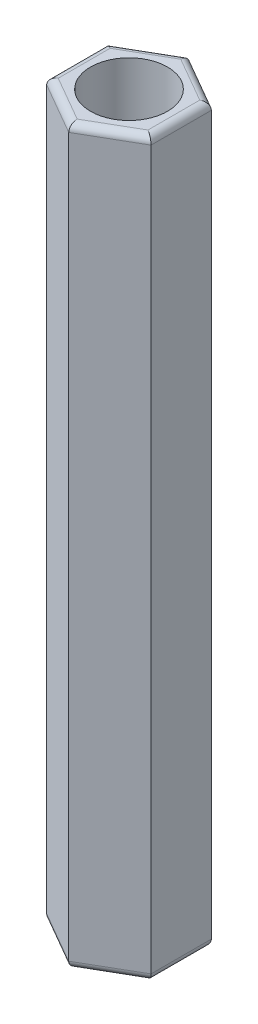
ISO-10303-21;
HEADER;
FILE_DESCRIPTION(('STEP AP214'),'2;1');
FILE_NAME('part.step','',(''),(''),'','','');
FILE_SCHEMA(('AUTOMOTIVE_DESIGN { 1 0 10303 214 1 1 1 1 }'));
ENDSEC;
DATA;
#1=APPLICATION_CONTEXT('core data for automotive mechanical design processes');
#2=APPLICATION_PROTOCOL_DEFINITION('international standard','automotive_design',2000,#1);
#3=PRODUCT_CONTEXT('',#1,'mechanical');
#4=PRODUCT('Part','Part','',(#3));
#5=PRODUCT_RELATED_PRODUCT_CATEGORY('part','',(#4));
#6=PRODUCT_DEFINITION_FORMATION('','',#4);
#7=PRODUCT_DEFINITION_CONTEXT('part definition',#1,'design');
#8=PRODUCT_DEFINITION('design','',#6,#7);
#9=PRODUCT_DEFINITION_SHAPE('','',#8);
#10=(LENGTH_UNIT() NAMED_UNIT(*) SI_UNIT(.MILLI.,.METRE.));
#11=(NAMED_UNIT(*) PLANE_ANGLE_UNIT() SI_UNIT($,.RADIAN.));
#12=(NAMED_UNIT(*) SI_UNIT($,.STERADIAN.) SOLID_ANGLE_UNIT());
#13=UNCERTAINTY_MEASURE_WITH_UNIT(LENGTH_MEASURE(1.E-05),#10,'distance_accuracy_value','');
#14=(GEOMETRIC_REPRESENTATION_CONTEXT(3) GLOBAL_UNCERTAINTY_ASSIGNED_CONTEXT((#13)) GLOBAL_UNIT_ASSIGNED_CONTEXT((#10,
#11,#12)) REPRESENTATION_CONTEXT('',''));
#15=CARTESIAN_POINT('',(0.,0.,0.));
#16=DIRECTION('',(0.,0.,1.));
#17=DIRECTION('',(1.,0.,0.));
#18=AXIS2_PLACEMENT_3D('',#15,#16,#17);
#19=CARTESIAN_POINT('',(0.,20.,0.));
#20=DIRECTION('',(0.,1.,0.));
#21=DIRECTION('',(0.,0.,1.));
#22=AXIS2_PLACEMENT_3D('',#19,#20,#21);
#23=PLANE('',#22);
#24=DIRECTION('',(-0.866025403784438,0.,0.5));
#25=VECTOR('',#24,1.);
#26=CARTESIAN_POINT('',(-1.325,20.,-0.649519052838329));
#27=LINE('',#26,#25);
#28=CARTESIAN_POINT('',(0.,20.,-1.41450815951458));
#29=VERTEX_POINT('',#28);
#30=CARTESIAN_POINT('',(-1.225,20.,-0.707254079757291));
#31=VERTEX_POINT('',#30);
#32=EDGE_CURVE('E42',#29,#31,#27,.T.);
#33=ORIENTED_EDGE('',*,*,#32,.T.);
#34=DIRECTION('',(0.,0.,1.));
#35=VECTOR('',#34,1.);
#36=CARTESIAN_POINT('',(-1.225,20.,0.822724133595218));
#37=LINE('',#36,#35);
#38=CARTESIAN_POINT('',(-1.225,20.,0.707254079757293));
#39=VERTEX_POINT('',#38);
#40=EDGE_CURVE('E11',#31,#39,#37,.T.);
#41=ORIENTED_EDGE('',*,*,#40,.T.);
#42=DIRECTION('',(0.866025403784439,0.,0.5));
#43=VECTOR('',#42,1.);
#44=CARTESIAN_POINT('',(0.1,20.,1.47224318643355));
#45=LINE('',#44,#43);
#46=CARTESIAN_POINT('',(0.,20.,1.41450815951458));
#47=VERTEX_POINT('',#46);
#48=EDGE_CURVE('E187',#39,#47,#45,.T.);
#49=ORIENTED_EDGE('',*,*,#48,.T.);
#50=DIRECTION('',(0.866025403784438,0.,-0.5));
#51=VECTOR('',#50,1.);
#52=CARTESIAN_POINT('',(1.325,20.,0.649519052838329));
#53=LINE('',#52,#51);
#54=CARTESIAN_POINT('',(1.225,20.,0.707254079757291));
#55=VERTEX_POINT('',#54);
#56=EDGE_CURVE('E185',#47,#55,#53,.T.);
#57=ORIENTED_EDGE('',*,*,#56,.T.);
#58=DIRECTION('',(0.,0.,-1.));
#59=VECTOR('',#58,1.);
#60=CARTESIAN_POINT('',(1.225,20.,-0.822724133595217));
#61=LINE('',#60,#59);
#62=CARTESIAN_POINT('',(1.225,20.,-0.707254079757292));
#63=VERTEX_POINT('',#62);
#64=EDGE_CURVE('E183',#55,#63,#61,.T.);
#65=ORIENTED_EDGE('',*,*,#64,.T.);
#66=DIRECTION('',(-0.866025403784439,0.,-0.5));
#67=VECTOR('',#66,1.);
#68=CARTESIAN_POINT('',(-0.1,20.,-1.47224318643355));
#69=LINE('',#68,#67);
#70=EDGE_CURVE('E53',#63,#29,#69,.T.);
#71=ORIENTED_EDGE('',*,*,#70,.T.);
#72=EDGE_LOOP('',(#33,#41,#49,#57,#65,#71));
#73=FACE_BOUND('',#72,.T.);
#74=CARTESIAN_POINT('',(0.,20.,0.));
#75=DIRECTION('',(0.,1.,0.));
#76=DIRECTION('',(0.,0.,1.));
#77=AXIS2_PLACEMENT_3D('',#74,#75,#76);
#78=CIRCLE('',#77,1.05);
#79=CARTESIAN_POINT('',(0.,20.,1.05));
#80=VERTEX_POINT('',#79);
#81=EDGE_CURVE('E230',#80,#80,#78,.T.);
#82=ORIENTED_EDGE('',*,*,#81,.F.);
#83=EDGE_LOOP('',(#82));
#84=FACE_BOUND('',#83,.T.);
#85=ADVANCED_FACE('F33',(#73,#84),#23,.T.);
#86=CARTESIAN_POINT('',(0.,0.,0.));
#87=DIRECTION('',(0.,1.,0.));
#88=DIRECTION('',(0.,0.,1.));
#89=AXIS2_PLACEMENT_3D('',#86,#87,#88);
#90=PLANE('',#89);
#91=DIRECTION('',(-0.866025403784438,0.,0.5));
#92=VECTOR('',#91,1.);
#93=CARTESIAN_POINT('',(-0.612500000000001,0.,-1.06088111963594));
#94=LINE('',#93,#92);
#95=CARTESIAN_POINT('',(-1.225,0.,-0.707254079757291));
#96=VERTEX_POINT('',#95);
#97=CARTESIAN_POINT('',(0.,0.,-1.41450815951458));
#98=VERTEX_POINT('',#97);
#99=EDGE_CURVE('E214',#96,#98,#94,.F.);
#100=ORIENTED_EDGE('',*,*,#99,.T.);
#101=DIRECTION('',(-0.866025403784439,0.,-0.5));
#102=VECTOR('',#101,1.);
#103=CARTESIAN_POINT('',(0.6125,0.,-1.06088111963594));
#104=LINE('',#103,#102);
#105=CARTESIAN_POINT('',(1.225,0.,-0.707254079757292));
#106=VERTEX_POINT('',#105);
#107=EDGE_CURVE('E205',#98,#106,#104,.F.);
#108=ORIENTED_EDGE('',*,*,#107,.T.);
#109=DIRECTION('',(0.,0.,-1.));
#110=VECTOR('',#109,1.);
#111=CARTESIAN_POINT('',(1.225,0.,0.));
#112=LINE('',#111,#110);
#113=CARTESIAN_POINT('',(1.225,0.,0.707254079757291));
#114=VERTEX_POINT('',#113);
#115=EDGE_CURVE('E208',#106,#114,#112,.F.);
#116=ORIENTED_EDGE('',*,*,#115,.T.);
#117=DIRECTION('',(0.866025403784438,0.,-0.5));
#118=VECTOR('',#117,1.);
#119=CARTESIAN_POINT('',(0.612500000000001,0.,1.06088111963594));
#120=LINE('',#119,#118);
#121=CARTESIAN_POINT('',(0.,0.,1.41450815951458));
#122=VERTEX_POINT('',#121);
#123=EDGE_CURVE('E210',#114,#122,#120,.F.);
#124=ORIENTED_EDGE('',*,*,#123,.T.);
#125=DIRECTION('',(0.866025403784439,0.,0.5));
#126=VECTOR('',#125,1.);
#127=CARTESIAN_POINT('',(-0.6125,0.,1.06088111963594));
#128=LINE('',#127,#126);
#129=CARTESIAN_POINT('',(-1.225,0.,0.707254079757293));
#130=VERTEX_POINT('',#129);
#131=EDGE_CURVE('E212',#122,#130,#128,.F.);
#132=ORIENTED_EDGE('',*,*,#131,.T.);
#133=DIRECTION('',(0.,0.,1.));
#134=VECTOR('',#133,1.);
#135=CARTESIAN_POINT('',(-1.225,0.,0.));
#136=LINE('',#135,#134);
#137=EDGE_CURVE('E216',#130,#96,#136,.F.);
#138=ORIENTED_EDGE('',*,*,#137,.T.);
#139=EDGE_LOOP('',(#100,#108,#116,#124,#132,#138));
#140=FACE_BOUND('',#139,.T.);
#141=CARTESIAN_POINT('',(0.,0.,0.));
#142=DIRECTION('',(0.,1.,0.));
#143=DIRECTION('',(0.,0.,1.));
#144=AXIS2_PLACEMENT_3D('',#141,#142,#143);
#145=CIRCLE('',#144,1.05);
#146=CARTESIAN_POINT('',(0.,0.,1.05));
#147=VERTEX_POINT('',#146);
#148=EDGE_CURVE('E167',#147,#147,#145,.T.);
#149=ORIENTED_EDGE('',*,*,#148,.T.);
#150=EDGE_LOOP('',(#149));
#151=FACE_BOUND('',#150,.T.);
#152=ADVANCED_FACE('F240',(#140,#151),#90,.F.);
#153=CARTESIAN_POINT('',(1.425,20.,0.822724133595217));
#154=DIRECTION('',(-1.,0.,0.));
#155=DIRECTION('',(0.,0.,1.));
#156=AXIS2_PLACEMENT_3D('',#153,#154,#155);
#157=PLANE('',#156);
#158=DIRECTION('',(0.,-1.,0.));
#159=VECTOR('',#158,1.);
#160=CARTESIAN_POINT('',(1.425,20.,0.822724133595217));
#161=LINE('',#160,#159);
#162=CARTESIAN_POINT('',(1.425,19.8,0.822724133595217));
#163=VERTEX_POINT('',#162);
#164=CARTESIAN_POINT('',(1.425,0.199999999999999,0.822724133595217));
#165=VERTEX_POINT('',#164);
#166=EDGE_CURVE('E227',#163,#165,#161,.T.);
#167=ORIENTED_EDGE('',*,*,#166,.T.);
#168=DIRECTION('',(0.,0.,-1.));
#169=VECTOR('',#168,1.);
#170=CARTESIAN_POINT('',(1.425,0.199999999999999,0.822724133595217));
#171=LINE('',#170,#169);
#172=CARTESIAN_POINT('',(1.425,0.199999999999999,-0.822724133595217));
#173=VERTEX_POINT('',#172);
#174=EDGE_CURVE('E201',#165,#173,#171,.T.);
#175=ORIENTED_EDGE('',*,*,#174,.T.);
#176=DIRECTION('',(0.,-1.,0.));
#177=VECTOR('',#176,1.);
#178=CARTESIAN_POINT('',(1.425,20.,-0.822724133595217));
#179=LINE('',#178,#177);
#180=CARTESIAN_POINT('',(1.425,19.8,-0.822724133595217));
#181=VERTEX_POINT('',#180);
#182=EDGE_CURVE('E144',#181,#173,#179,.T.);
#183=ORIENTED_EDGE('',*,*,#182,.F.);
#184=DIRECTION('',(0.,0.,-1.));
#185=VECTOR('',#184,1.);
#186=CARTESIAN_POINT('',(1.425,19.8,0.822724133595217));
#187=LINE('',#186,#185);
#188=EDGE_CURVE('E203',#181,#163,#187,.F.);
#189=ORIENTED_EDGE('',*,*,#188,.T.);
#190=EDGE_LOOP('',(#167,#175,#183,#189));
#191=FACE_BOUND('',#190,.T.);
#192=ADVANCED_FACE('F245',(#191),#157,.F.);
#193=CARTESIAN_POINT('',(1.425,20.,-0.822724133595217));
#194=DIRECTION('',(-0.5,0.,0.866025403784439));
#195=DIRECTION('',(0.866025403784439,0.,0.5));
#196=AXIS2_PLACEMENT_3D('',#193,#194,#195);
#197=PLANE('',#196);
#198=ORIENTED_EDGE('',*,*,#182,.T.);
#199=DIRECTION('',(-0.866025403784439,0.,-0.5));
#200=VECTOR('',#199,1.);
#201=CARTESIAN_POINT('',(1.425,0.199999999999999,-0.822724133595217));
#202=LINE('',#201,#200);
#203=CARTESIAN_POINT('',(0.,0.199999999999999,-1.64544826719043));
#204=VERTEX_POINT('',#203);
#205=EDGE_CURVE('E143',#173,#204,#202,.T.);
#206=ORIENTED_EDGE('',*,*,#205,.T.);
#207=DIRECTION('',(0.,-1.,0.));
#208=VECTOR('',#207,1.);
#209=CARTESIAN_POINT('',(0.,20.,-1.64544826719043));
#210=LINE('',#209,#208);
#211=CARTESIAN_POINT('',(0.,19.8,-1.64544826719043));
#212=VERTEX_POINT('',#211);
#213=EDGE_CURVE('E126',#212,#204,#210,.T.);
#214=ORIENTED_EDGE('',*,*,#213,.F.);
#215=DIRECTION('',(-0.866025403784439,0.,-0.5));
#216=VECTOR('',#215,1.);
#217=CARTESIAN_POINT('',(1.425,19.8,-0.822724133595217));
#218=LINE('',#217,#216);
#219=EDGE_CURVE('E140',#212,#181,#218,.F.);
#220=ORIENTED_EDGE('',*,*,#219,.T.);
#221=EDGE_LOOP('',(#198,#206,#214,#220));
#222=FACE_BOUND('',#221,.T.);
#223=ADVANCED_FACE('F139',(#222),#197,.F.);
#224=CARTESIAN_POINT('',(0.,20.,-1.64544826719043));
#225=DIRECTION('',(0.5,0.,0.866025403784438));
#226=DIRECTION('',(0.866025403784438,0.,-0.5));
#227=AXIS2_PLACEMENT_3D('',#224,#225,#226);
#228=PLANE('',#227);
#229=ORIENTED_EDGE('',*,*,#213,.T.);
#230=DIRECTION('',(-0.866025403784438,0.,0.5));
#231=VECTOR('',#230,1.);
#232=CARTESIAN_POINT('',(0.,0.199999999999999,-1.64544826719043));
#233=LINE('',#232,#231);
#234=CARTESIAN_POINT('',(-1.425,0.199999999999999,-0.822724133595217));
#235=VERTEX_POINT('',#234);
#236=EDGE_CURVE('E132',#204,#235,#233,.T.);
#237=ORIENTED_EDGE('',*,*,#236,.T.);
#238=DIRECTION('',(0.,-1.,0.));
#239=VECTOR('',#238,1.);
#240=CARTESIAN_POINT('',(-1.425,20.,-0.822724133595217));
#241=LINE('',#240,#239);
#242=CARTESIAN_POINT('',(-1.425,19.8,-0.822724133595217));
#243=VERTEX_POINT('',#242);
#244=EDGE_CURVE('E128',#243,#235,#241,.T.);
#245=ORIENTED_EDGE('',*,*,#244,.F.);
#246=DIRECTION('',(-0.866025403784438,0.,0.5));
#247=VECTOR('',#246,1.);
#248=CARTESIAN_POINT('',(0.,19.8,-1.64544826719043));
#249=LINE('',#248,#247);
#250=EDGE_CURVE('E123',#243,#212,#249,.F.);
#251=ORIENTED_EDGE('',*,*,#250,.T.);
#252=EDGE_LOOP('',(#229,#237,#245,#251));
#253=FACE_BOUND('',#252,.T.);
#254=ADVANCED_FACE('F125',(#253),#228,.F.);
#255=CARTESIAN_POINT('',(-1.425,20.,-0.822724133595217));
#256=DIRECTION('',(1.,0.,0.));
#257=DIRECTION('',(0.,0.,-1.));
#258=AXIS2_PLACEMENT_3D('',#255,#256,#257);
#259=PLANE('',#258);
#260=ORIENTED_EDGE('',*,*,#244,.T.);
#261=DIRECTION('',(0.,0.,1.));
#262=VECTOR('',#261,1.);
#263=CARTESIAN_POINT('',(-1.425,0.199999999999999,-0.822724133595217));
#264=LINE('',#263,#262);
#265=CARTESIAN_POINT('',(-1.425,0.199999999999999,0.822724133595218));
#266=VERTEX_POINT('',#265);
#267=EDGE_CURVE('E189',#235,#266,#264,.T.);
#268=ORIENTED_EDGE('',*,*,#267,.T.);
#269=DIRECTION('',(0.,-1.,0.));
#270=VECTOR('',#269,1.);
#271=CARTESIAN_POINT('',(-1.425,20.,0.822724133595218));
#272=LINE('',#271,#270);
#273=CARTESIAN_POINT('',(-1.425,19.8,0.822724133595218));
#274=VERTEX_POINT('',#273);
#275=EDGE_CURVE('E221',#274,#266,#272,.T.);
#276=ORIENTED_EDGE('',*,*,#275,.F.);
#277=DIRECTION('',(0.,0.,1.));
#278=VECTOR('',#277,1.);
#279=CARTESIAN_POINT('',(-1.425,19.8,-0.822724133595217));
#280=LINE('',#279,#278);
#281=EDGE_CURVE('E191',#274,#243,#280,.F.);
#282=ORIENTED_EDGE('',*,*,#281,.T.);
#283=EDGE_LOOP('',(#260,#268,#276,#282));
#284=FACE_BOUND('',#283,.T.);
#285=ADVANCED_FACE('F257',(#284),#259,.F.);
#286=CARTESIAN_POINT('',(-1.425,20.,0.822724133595218));
#287=DIRECTION('',(0.5,0.,-0.866025403784439));
#288=DIRECTION('',(-0.866025403784439,0.,-0.5));
#289=AXIS2_PLACEMENT_3D('',#286,#287,#288);
#290=PLANE('',#289);
#291=ORIENTED_EDGE('',*,*,#275,.T.);
#292=DIRECTION('',(0.866025403784439,0.,0.5));
#293=VECTOR('',#292,1.);
#294=CARTESIAN_POINT('',(-1.425,0.199999999999999,0.822724133595218));
#295=LINE('',#294,#293);
#296=CARTESIAN_POINT('',(0.,0.199999999999999,1.64544826719043));
#297=VERTEX_POINT('',#296);
#298=EDGE_CURVE('E133',#266,#297,#295,.T.);
#299=ORIENTED_EDGE('',*,*,#298,.T.);
#300=DIRECTION('',(0.,-1.,0.));
#301=VECTOR('',#300,1.);
#302=CARTESIAN_POINT('',(0.,20.,1.64544826719043));
#303=LINE('',#302,#301);
#304=CARTESIAN_POINT('',(0.,19.8,1.64544826719043));
#305=VERTEX_POINT('',#304);
#306=EDGE_CURVE('E224',#305,#297,#303,.T.);
#307=ORIENTED_EDGE('',*,*,#306,.F.);
#308=DIRECTION('',(0.866025403784439,0.,0.5));
#309=VECTOR('',#308,1.);
#310=CARTESIAN_POINT('',(-1.425,19.8,0.822724133595219));
#311=LINE('',#310,#309);
#312=EDGE_CURVE('E195',#305,#274,#311,.F.);
#313=ORIENTED_EDGE('',*,*,#312,.T.);
#314=EDGE_LOOP('',(#291,#299,#307,#313));
#315=FACE_BOUND('',#314,.T.);
#316=ADVANCED_FACE('F253',(#315),#290,.F.);
#317=CARTESIAN_POINT('',(0.,20.,1.64544826719043));
#318=DIRECTION('',(-0.5,0.,-0.866025403784438));
#319=DIRECTION('',(-0.866025403784438,0.,0.5));
#320=AXIS2_PLACEMENT_3D('',#317,#318,#319);
#321=PLANE('',#320);
#322=ORIENTED_EDGE('',*,*,#306,.T.);
#323=DIRECTION('',(0.866025403784438,0.,-0.5));
#324=VECTOR('',#323,1.);
#325=CARTESIAN_POINT('',(0.,0.199999999999999,1.64544826719043));
#326=LINE('',#325,#324);
#327=EDGE_CURVE('E197',#297,#165,#326,.T.);
#328=ORIENTED_EDGE('',*,*,#327,.T.);
#329=ORIENTED_EDGE('',*,*,#166,.F.);
#330=DIRECTION('',(0.866025403784438,0.,-0.5));
#331=VECTOR('',#330,1.);
#332=CARTESIAN_POINT('',(0.,19.8,1.64544826719043));
#333=LINE('',#332,#331);
#334=EDGE_CURVE('E199',#163,#305,#333,.F.);
#335=ORIENTED_EDGE('',*,*,#334,.T.);
#336=EDGE_LOOP('',(#322,#328,#329,#335));
#337=FACE_BOUND('',#336,.T.);
#338=ADVANCED_FACE('F250',(#337),#321,.F.);
#339=CARTESIAN_POINT('',(0.,20.,0.));
#340=DIRECTION('',(0.,-1.,0.));
#341=DIRECTION('',(0.,0.,-1.));
#342=AXIS2_PLACEMENT_3D('',#339,#340,#341);
#343=CYLINDRICAL_SURFACE('',#342,1.05);
#344=ORIENTED_EDGE('',*,*,#81,.T.);
#345=EDGE_LOOP('',(#344));
#346=FACE_BOUND('',#345,.T.);
#347=ORIENTED_EDGE('',*,*,#148,.F.);
#348=EDGE_LOOP('',(#347));
#349=FACE_BOUND('',#348,.T.);
#350=ADVANCED_FACE('F236',(#346,#349),#343,.F.);
#351=CARTESIAN_POINT('',(-1.325,0.199999999999999,0.649519052838331));
#352=DIRECTION('',(0.866025403784439,0.,0.5));
#353=DIRECTION('',(0.5,0.,-0.866025403784439));
#354=AXIS2_PLACEMENT_3D('',#351,#352,#353);
#355=CYLINDRICAL_SURFACE('',#354,0.2);
#356=CARTESIAN_POINT('',(-1.225,0.199999999999999,0.707254079757293));
#357=DIRECTION('',(0.5,0.,0.866025403784439));
#358=DIRECTION('',(-0.866025403784439,0.,0.5));
#359=AXIS2_PLACEMENT_3D('',#356,#357,#358);
#360=ELLIPSE('',#359,0.23094010767585,0.2);
#361=EDGE_CURVE('E168',#130,#266,#360,.F.);
#362=ORIENTED_EDGE('',*,*,#361,.F.);
#363=ORIENTED_EDGE('',*,*,#131,.F.);
#364=CARTESIAN_POINT('',(0.,0.199999999999999,1.41450815951458));
#365=DIRECTION('',(1.,0.,0.));
#366=DIRECTION('',(0.,0.,1.));
#367=AXIS2_PLACEMENT_3D('',#364,#365,#366);
#368=ELLIPSE('',#367,0.23094010767585,0.2);
#369=EDGE_CURVE('E164',#297,#122,#368,.T.);
#370=ORIENTED_EDGE('',*,*,#369,.F.);
#371=ORIENTED_EDGE('',*,*,#298,.F.);
#372=EDGE_LOOP('',(#362,#363,#370,#371));
#373=FACE_BOUND('',#372,.T.);
#374=ADVANCED_FACE('F288',(#373),#355,.T.);
#375=CARTESIAN_POINT('',(-0.1,0.199999999999999,1.47224318643355));
#376=DIRECTION('',(0.866025403784438,0.,-0.5));
#377=DIRECTION('',(-0.5,0.,-0.866025403784438));
#378=AXIS2_PLACEMENT_3D('',#375,#376,#377);
#379=CYLINDRICAL_SURFACE('',#378,0.2);
#380=ORIENTED_EDGE('',*,*,#369,.T.);
#381=ORIENTED_EDGE('',*,*,#123,.F.);
#382=CARTESIAN_POINT('',(1.225,0.199999999999999,0.707254079757291));
#383=DIRECTION('',(0.5,0.,-0.866025403784439));
#384=DIRECTION('',(0.866025403784439,0.,0.5));
#385=AXIS2_PLACEMENT_3D('',#382,#383,#384);
#386=ELLIPSE('',#385,0.23094010767585,0.2);
#387=EDGE_CURVE('E171',#165,#114,#386,.T.);
#388=ORIENTED_EDGE('',*,*,#387,.F.);
#389=ORIENTED_EDGE('',*,*,#327,.F.);
#390=EDGE_LOOP('',(#380,#381,#388,#389));
#391=FACE_BOUND('',#390,.T.);
#392=ADVANCED_FACE('F284',(#391),#379,.T.);
#393=CARTESIAN_POINT('',(-1.225,0.199999999999999,-0.822724133595217));
#394=DIRECTION('',(0.,0.,1.));
#395=DIRECTION('',(1.,0.,0.));
#396=AXIS2_PLACEMENT_3D('',#393,#394,#395);
#397=CYLINDRICAL_SURFACE('',#396,0.2);
#398=ORIENTED_EDGE('',*,*,#361,.T.);
#399=ORIENTED_EDGE('',*,*,#267,.F.);
#400=CARTESIAN_POINT('',(-1.225,0.199999999999999,-0.707254079757291));
#401=DIRECTION('',(-0.5,0.,0.866025403784439));
#402=DIRECTION('',(0.866025403784439,0.,0.5));
#403=AXIS2_PLACEMENT_3D('',#400,#401,#402);
#404=ELLIPSE('',#403,0.23094010767585,0.2);
#405=EDGE_CURVE('E174',#96,#235,#404,.F.);
#406=ORIENTED_EDGE('',*,*,#405,.F.);
#407=ORIENTED_EDGE('',*,*,#137,.F.);
#408=EDGE_LOOP('',(#398,#399,#406,#407));
#409=FACE_BOUND('',#408,.T.);
#410=ADVANCED_FACE('F280',(#409),#397,.T.);
#411=CARTESIAN_POINT('',(1.225,0.199999999999999,0.822724133595217));
#412=DIRECTION('',(0.,0.,-1.));
#413=DIRECTION('',(-1.,0.,0.));
#414=AXIS2_PLACEMENT_3D('',#411,#412,#413);
#415=CYLINDRICAL_SURFACE('',#414,0.2);
#416=ORIENTED_EDGE('',*,*,#387,.T.);
#417=ORIENTED_EDGE('',*,*,#115,.F.);
#418=CARTESIAN_POINT('',(1.225,0.199999999999999,-0.707254079757292));
#419=DIRECTION('',(-0.5,0.,-0.866025403784438));
#420=DIRECTION('',(0.866025403784439,0.,-0.5));
#421=AXIS2_PLACEMENT_3D('',#418,#419,#420);
#422=ELLIPSE('',#421,0.23094010767585,0.2);
#423=EDGE_CURVE('E177',#173,#106,#422,.T.);
#424=ORIENTED_EDGE('',*,*,#423,.F.);
#425=ORIENTED_EDGE('',*,*,#174,.F.);
#426=EDGE_LOOP('',(#416,#417,#424,#425));
#427=FACE_BOUND('',#426,.T.);
#428=ADVANCED_FACE('F276',(#427),#415,.T.);
#429=CARTESIAN_POINT('',(0.1,0.199999999999999,-1.47224318643355));
#430=DIRECTION('',(-0.866025403784438,0.,0.5));
#431=DIRECTION('',(0.5,0.,0.866025403784438));
#432=AXIS2_PLACEMENT_3D('',#429,#430,#431);
#433=CYLINDRICAL_SURFACE('',#432,0.2);
#434=ORIENTED_EDGE('',*,*,#405,.T.);
#435=ORIENTED_EDGE('',*,*,#236,.F.);
#436=CARTESIAN_POINT('',(0.,0.199999999999999,-1.41450815951458));
#437=DIRECTION('',(-1.,0.,0.));
#438=DIRECTION('',(0.,0.,1.));
#439=AXIS2_PLACEMENT_3D('',#436,#437,#438);
#440=ELLIPSE('',#439,0.23094010767585,0.2);
#441=EDGE_CURVE('E179',#98,#204,#440,.F.);
#442=ORIENTED_EDGE('',*,*,#441,.F.);
#443=ORIENTED_EDGE('',*,*,#99,.F.);
#444=EDGE_LOOP('',(#434,#435,#442,#443));
#445=FACE_BOUND('',#444,.T.);
#446=ADVANCED_FACE('F272',(#445),#433,.T.);
#447=CARTESIAN_POINT('',(1.325,0.199999999999999,-0.64951905283833));
#448=DIRECTION('',(-0.866025403784439,0.,-0.5));
#449=DIRECTION('',(-0.5,0.,0.866025403784439));
#450=AXIS2_PLACEMENT_3D('',#447,#448,#449);
#451=CYLINDRICAL_SURFACE('',#450,0.2);
#452=ORIENTED_EDGE('',*,*,#423,.T.);
#453=ORIENTED_EDGE('',*,*,#107,.F.);
#454=ORIENTED_EDGE('',*,*,#441,.T.);
#455=ORIENTED_EDGE('',*,*,#205,.F.);
#456=EDGE_LOOP('',(#452,#453,#454,#455));
#457=FACE_BOUND('',#456,.T.);
#458=ADVANCED_FACE('F269',(#457),#451,.T.);
#459=CARTESIAN_POINT('',(1.225,19.8,0.));
#460=DIRECTION('',(0.,0.,1.));
#461=DIRECTION('',(1.,0.,0.));
#462=AXIS2_PLACEMENT_3D('',#459,#460,#461);
#463=CYLINDRICAL_SURFACE('',#462,0.2);
#464=CARTESIAN_POINT('',(1.225,19.8,0.707254079757292));
#465=DIRECTION('',(-0.5,0.,0.866025403784439));
#466=DIRECTION('',(-0.866025403784439,0.,-0.5));
#467=AXIS2_PLACEMENT_3D('',#464,#465,#466);
#468=ELLIPSE('',#467,0.23094010767585,0.2);
#469=EDGE_CURVE('E153',#163,#55,#468,.T.);
#470=ORIENTED_EDGE('',*,*,#469,.F.);
#471=ORIENTED_EDGE('',*,*,#188,.F.);
#472=CARTESIAN_POINT('',(1.225,19.8,-0.707254079757292));
#473=DIRECTION('',(0.5,0.,0.866025403784438));
#474=DIRECTION('',(-0.866025403784439,0.,0.5));
#475=AXIS2_PLACEMENT_3D('',#472,#473,#474);
#476=ELLIPSE('',#475,0.23094010767585,0.2);
#477=EDGE_CURVE('E37',#63,#181,#476,.F.);
#478=ORIENTED_EDGE('',*,*,#477,.F.);
#479=ORIENTED_EDGE('',*,*,#64,.F.);
#480=EDGE_LOOP('',(#470,#471,#478,#479));
#481=FACE_BOUND('',#480,.T.);
#482=ADVANCED_FACE('F35',(#481),#463,.T.);
#483=CARTESIAN_POINT('',(0.6125,19.8,-1.06088111963594));
#484=DIRECTION('',(0.866025403784439,0.,0.5));
#485=DIRECTION('',(0.5,0.,-0.866025403784439));
#486=AXIS2_PLACEMENT_3D('',#483,#484,#485);
#487=CYLINDRICAL_SURFACE('',#486,0.2);
#488=ORIENTED_EDGE('',*,*,#477,.T.);
#489=ORIENTED_EDGE('',*,*,#219,.F.);
#490=CARTESIAN_POINT('',(0.,19.8,-1.41450815951458));
#491=DIRECTION('',(1.,0.,0.));
#492=DIRECTION('',(0.,0.,1.));
#493=AXIS2_PLACEMENT_3D('',#490,#491,#492);
#494=ELLIPSE('',#493,0.23094010767585,0.2);
#495=EDGE_CURVE('E149',#29,#212,#494,.F.);
#496=ORIENTED_EDGE('',*,*,#495,.F.);
#497=ORIENTED_EDGE('',*,*,#70,.F.);
#498=EDGE_LOOP('',(#488,#489,#496,#497));
#499=FACE_BOUND('',#498,.T.);
#500=ADVANCED_FACE('F148',(#499),#487,.T.);
#501=CARTESIAN_POINT('',(0.612500000000001,19.8,1.06088111963594));
#502=DIRECTION('',(-0.866025403784438,0.,0.5));
#503=DIRECTION('',(0.5,0.,0.866025403784438));
#504=AXIS2_PLACEMENT_3D('',#501,#502,#503);
#505=CYLINDRICAL_SURFACE('',#504,0.2);
#506=ORIENTED_EDGE('',*,*,#469,.T.);
#507=ORIENTED_EDGE('',*,*,#56,.F.);
#508=CARTESIAN_POINT('',(0.,19.8,1.41450815951458));
#509=DIRECTION('',(-1.,0.,0.));
#510=DIRECTION('',(0.,0.,-1.));
#511=AXIS2_PLACEMENT_3D('',#508,#509,#510);
#512=ELLIPSE('',#511,0.23094010767585,0.2);
#513=EDGE_CURVE('E154',#305,#47,#512,.T.);
#514=ORIENTED_EDGE('',*,*,#513,.F.);
#515=ORIENTED_EDGE('',*,*,#334,.F.);
#516=EDGE_LOOP('',(#506,#507,#514,#515));
#517=FACE_BOUND('',#516,.T.);
#518=ADVANCED_FACE('F303',(#517),#505,.T.);
#519=CARTESIAN_POINT('',(-0.612500000000001,19.8,-1.06088111963594));
#520=DIRECTION('',(0.866025403784438,0.,-0.5));
#521=DIRECTION('',(-0.5,0.,-0.866025403784438));
#522=AXIS2_PLACEMENT_3D('',#519,#520,#521);
#523=CYLINDRICAL_SURFACE('',#522,0.2);
#524=ORIENTED_EDGE('',*,*,#495,.T.);
#525=ORIENTED_EDGE('',*,*,#250,.F.);
#526=CARTESIAN_POINT('',(-1.225,19.8,-0.707254079757292));
#527=DIRECTION('',(0.5,0.,-0.866025403784439));
#528=DIRECTION('',(0.866025403784439,0.,0.5));
#529=AXIS2_PLACEMENT_3D('',#526,#527,#528);
#530=ELLIPSE('',#529,0.23094010767585,0.2);
#531=EDGE_CURVE('E158',#31,#243,#530,.F.);
#532=ORIENTED_EDGE('',*,*,#531,.F.);
#533=ORIENTED_EDGE('',*,*,#32,.F.);
#534=EDGE_LOOP('',(#524,#525,#532,#533));
#535=FACE_BOUND('',#534,.T.);
#536=ADVANCED_FACE('F152',(#535),#523,.T.);
#537=CARTESIAN_POINT('',(-0.6125,19.8,1.06088111963594));
#538=DIRECTION('',(-0.866025403784439,0.,-0.5));
#539=DIRECTION('',(-0.5,0.,0.866025403784439));
#540=AXIS2_PLACEMENT_3D('',#537,#538,#539);
#541=CYLINDRICAL_SURFACE('',#540,0.2);
#542=ORIENTED_EDGE('',*,*,#513,.T.);
#543=ORIENTED_EDGE('',*,*,#48,.F.);
#544=CARTESIAN_POINT('',(-1.225,19.8,0.707254079757293));
#545=DIRECTION('',(-0.5,0.,-0.866025403784439));
#546=DIRECTION('',(-0.866025403784439,0.,0.5));
#547=AXIS2_PLACEMENT_3D('',#544,#545,#546);
#548=ELLIPSE('',#547,0.23094010767585,0.2);
#549=EDGE_CURVE('E162',#274,#39,#548,.T.);
#550=ORIENTED_EDGE('',*,*,#549,.F.);
#551=ORIENTED_EDGE('',*,*,#312,.F.);
#552=EDGE_LOOP('',(#542,#543,#550,#551));
#553=FACE_BOUND('',#552,.T.);
#554=ADVANCED_FACE('F296',(#553),#541,.T.);
#555=CARTESIAN_POINT('',(-1.225,19.8,0.));
#556=DIRECTION('',(0.,0.,-1.));
#557=DIRECTION('',(-1.,0.,0.));
#558=AXIS2_PLACEMENT_3D('',#555,#556,#557);
#559=CYLINDRICAL_SURFACE('',#558,0.2);
#560=ORIENTED_EDGE('',*,*,#531,.T.);
#561=ORIENTED_EDGE('',*,*,#281,.F.);
#562=ORIENTED_EDGE('',*,*,#549,.T.);
#563=ORIENTED_EDGE('',*,*,#40,.F.);
#564=EDGE_LOOP('',(#560,#561,#562,#563));
#565=FACE_BOUND('',#564,.T.);
#566=ADVANCED_FACE('F293',(#565),#559,.T.);
#567=CLOSED_SHELL('',(#85,#152,#192,#223,#254,#285,#316,#338,#350,#374,#392,#410,#428,#446,#458,
#482,#500,#518,#536,#554,#566));
#568=MANIFOLD_SOLID_BREP('B2',#567);
#569=ADVANCED_BREP_SHAPE_REPRESENTATION('',(#18,#568),#14);
#570=SHAPE_DEFINITION_REPRESENTATION(#9,#569);
ENDSEC;
END-ISO-10303-21;
